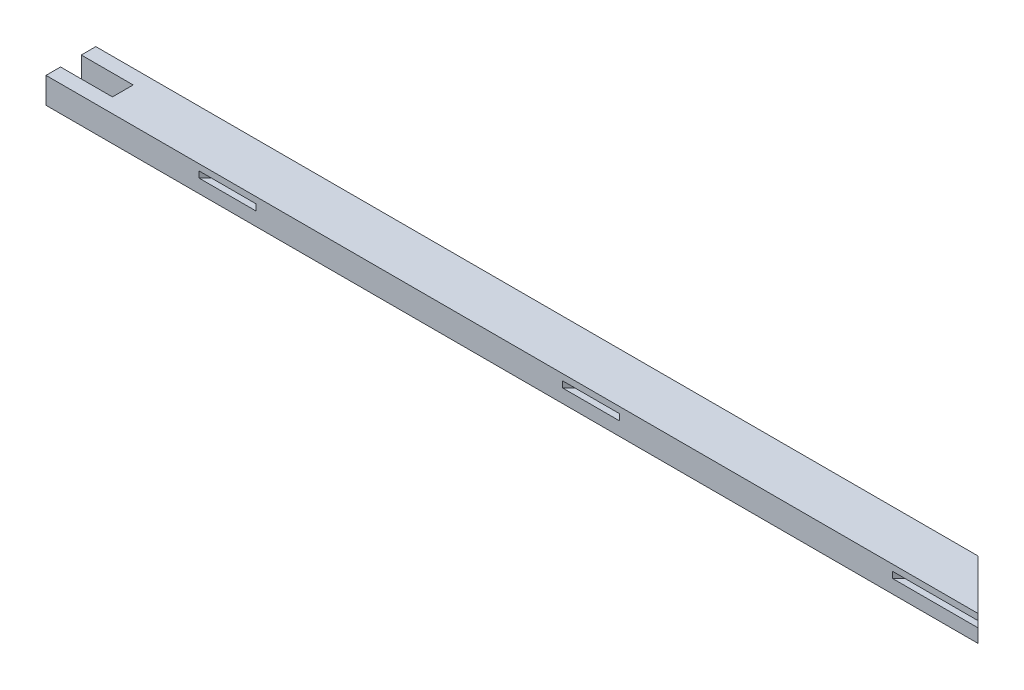
ISO-10303-21;
HEADER;
FILE_DESCRIPTION(('STEP AP214'),'2;1');
FILE_NAME('part.step','',(''),(''),'','','');
FILE_SCHEMA(('AUTOMOTIVE_DESIGN { 1 0 10303 214 1 1 1 1 }'));
ENDSEC;
DATA;
#1=APPLICATION_CONTEXT('core data for automotive mechanical design processes');
#2=APPLICATION_PROTOCOL_DEFINITION('international standard','automotive_design',2000,#1);
#3=PRODUCT_CONTEXT('',#1,'mechanical');
#4=PRODUCT('Part','Part','',(#3));
#5=PRODUCT_RELATED_PRODUCT_CATEGORY('part','',(#4));
#6=PRODUCT_DEFINITION_FORMATION('','',#4);
#7=PRODUCT_DEFINITION_CONTEXT('part definition',#1,'design');
#8=PRODUCT_DEFINITION('design','',#6,#7);
#9=PRODUCT_DEFINITION_SHAPE('','',#8);
#10=(LENGTH_UNIT() NAMED_UNIT(*) SI_UNIT(.MILLI.,.METRE.));
#11=(NAMED_UNIT(*) PLANE_ANGLE_UNIT() SI_UNIT($,.RADIAN.));
#12=(NAMED_UNIT(*) SI_UNIT($,.STERADIAN.) SOLID_ANGLE_UNIT());
#13=UNCERTAINTY_MEASURE_WITH_UNIT(LENGTH_MEASURE(1.E-05),#10,'distance_accuracy_value','');
#14=(GEOMETRIC_REPRESENTATION_CONTEXT(3) GLOBAL_UNCERTAINTY_ASSIGNED_CONTEXT((#13)) GLOBAL_UNIT_ASSIGNED_CONTEXT((#10,
#11,#12)) REPRESENTATION_CONTEXT('',''));
#15=CARTESIAN_POINT('',(0.,0.,0.));
#16=DIRECTION('',(0.,0.,1.));
#17=DIRECTION('',(1.,0.,0.));
#18=AXIS2_PLACEMENT_3D('',#15,#16,#17);
#19=CARTESIAN_POINT('',(898.,25.,48.0000000000001));
#20=DIRECTION('',(-0.707106781186542,0.,0.707106781186553));
#21=DIRECTION('',(0.707106781186553,0.,0.707106781186542));
#22=AXIS2_PLACEMENT_3D('',#19,#20,#21);
#23=PLANE('',#22);
#24=DIRECTION('',(-0.707106781186553,0.,-0.707106781186542));
#25=VECTOR('',#24,1.);
#26=CARTESIAN_POINT('',(898.,13.,48.0000000000001));
#27=LINE('',#26,#25);
#28=CARTESIAN_POINT('',(857.499999999999,13.,7.49999999999999));
#29=VERTEX_POINT('',#28);
#30=CARTESIAN_POINT('',(849.999999999999,13.,0.));
#31=VERTEX_POINT('',#30);
#32=EDGE_CURVE('E257',#29,#31,#27,.T.);
#33=ORIENTED_EDGE('',*,*,#32,.F.);
#34=DIRECTION('',(0.,-1.,0.));
#35=VECTOR('',#34,1.);
#36=CARTESIAN_POINT('',(857.499999999999,25.,7.49999999999999));
#37=LINE('',#36,#35);
#38=CARTESIAN_POINT('',(857.499999999999,19.,7.49999999999999));
#39=VERTEX_POINT('',#38);
#40=EDGE_CURVE('E11',#39,#29,#37,.T.);
#41=ORIENTED_EDGE('',*,*,#40,.F.);
#42=DIRECTION('',(-0.707106781186553,0.,-0.707106781186542));
#43=VECTOR('',#42,1.);
#44=CARTESIAN_POINT('',(898.,19.,48.0000000000001));
#45=LINE('',#44,#43);
#46=CARTESIAN_POINT('',(849.999999999999,19.,0.));
#47=VERTEX_POINT('',#46);
#48=EDGE_CURVE('E266',#39,#47,#45,.T.);
#49=ORIENTED_EDGE('',*,*,#48,.T.);
#50=DIRECTION('',(0.,-1.,0.));
#51=VECTOR('',#50,1.);
#52=CARTESIAN_POINT('',(849.999999999999,25.,0.));
#53=LINE('',#52,#51);
#54=CARTESIAN_POINT('',(849.999999999999,25.,0.));
#55=VERTEX_POINT('',#54);
#56=EDGE_CURVE('E466',#55,#47,#53,.T.);
#57=ORIENTED_EDGE('',*,*,#56,.F.);
#58=DIRECTION('',(-0.707106781186553,0.,-0.707106781186542));
#59=VECTOR('',#58,1.);
#60=CARTESIAN_POINT('',(898.,25.,48.0000000000001));
#61=LINE('',#60,#59);
#62=CARTESIAN_POINT('',(898.,25.,48.0000000000001));
#63=VERTEX_POINT('',#62);
#64=EDGE_CURVE('E446',#63,#55,#61,.T.);
#65=ORIENTED_EDGE('',*,*,#64,.F.);
#66=DIRECTION('',(0.,-1.,0.));
#67=VECTOR('',#66,1.);
#68=CARTESIAN_POINT('',(898.,25.,48.0000000000001));
#69=LINE('',#68,#67);
#70=CARTESIAN_POINT('',(898.,19.,48.0000000000001));
#71=VERTEX_POINT('',#70);
#72=EDGE_CURVE('E469',#63,#71,#69,.T.);
#73=ORIENTED_EDGE('',*,*,#72,.T.);
#74=DIRECTION('',(-0.707106781186546,0.,-0.70710678118655));
#75=VECTOR('',#74,1.);
#76=CARTESIAN_POINT('',(898.,19.,48.0000000000001));
#77=LINE('',#76,#75);
#78=CARTESIAN_POINT('',(890.5,19.,40.5));
#79=VERTEX_POINT('',#78);
#80=EDGE_CURVE('E274',#71,#79,#77,.T.);
#81=ORIENTED_EDGE('',*,*,#80,.T.);
#82=DIRECTION('',(0.,1.,0.));
#83=VECTOR('',#82,1.);
#84=CARTESIAN_POINT('',(890.5,13.,40.5));
#85=LINE('',#84,#83);
#86=CARTESIAN_POINT('',(890.5,13.,40.5));
#87=VERTEX_POINT('',#86);
#88=EDGE_CURVE('E287',#87,#79,#85,.T.);
#89=ORIENTED_EDGE('',*,*,#88,.F.);
#90=DIRECTION('',(-0.707106781186546,0.,-0.70710678118655));
#91=VECTOR('',#90,1.);
#92=CARTESIAN_POINT('',(898.,13.,48.0000000000001));
#93=LINE('',#92,#91);
#94=CARTESIAN_POINT('',(898.,13.,48.0000000000001));
#95=VERTEX_POINT('',#94);
#96=EDGE_CURVE('E275',#95,#87,#93,.T.);
#97=ORIENTED_EDGE('',*,*,#96,.F.);
#98=CARTESIAN_POINT('',(898.,0.,48.0000000000001));
#99=VERTEX_POINT('',#98);
#100=EDGE_CURVE('E468',#95,#99,#69,.T.);
#101=ORIENTED_EDGE('',*,*,#100,.T.);
#102=DIRECTION('',(-0.707106781186553,0.,-0.707106781186542));
#103=VECTOR('',#102,1.);
#104=CARTESIAN_POINT('',(898.,0.,48.0000000000001));
#105=LINE('',#104,#103);
#106=CARTESIAN_POINT('',(849.999999999999,0.,0.));
#107=VERTEX_POINT('',#106);
#108=EDGE_CURVE('E434',#99,#107,#105,.T.);
#109=ORIENTED_EDGE('',*,*,#108,.T.);
#110=EDGE_CURVE('E448',#31,#107,#53,.T.);
#111=ORIENTED_EDGE('',*,*,#110,.F.);
#112=EDGE_LOOP('',(#33,#41,#49,#57,#65,#73,#81,#89,#97,#101,#109,#111));
#113=FACE_BOUND('',#112,.T.);
#114=ADVANCED_FACE('F35',(#113),#23,.F.);
#115=CARTESIAN_POINT('',(849.999999999999,25.,0.));
#116=DIRECTION('',(0.,0.,1.));
#117=DIRECTION('',(1.,0.,0.));
#118=AXIS2_PLACEMENT_3D('',#115,#116,#117);
#119=PLANE('',#118);
#120=DIRECTION('',(-1.,0.,0.));
#121=VECTOR('',#120,1.);
#122=CARTESIAN_POINT('',(497.5,13.,0.));
#123=LINE('',#122,#121);
#124=CARTESIAN_POINT('',(552.5,13.,0.));
#125=VERTEX_POINT('',#124);
#126=CARTESIAN_POINT('',(497.5,13.,0.));
#127=VERTEX_POINT('',#126);
#128=EDGE_CURVE('E362',#125,#127,#123,.T.);
#129=ORIENTED_EDGE('',*,*,#128,.F.);
#130=DIRECTION('',(0.,1.,0.));
#131=VECTOR('',#130,1.);
#132=CARTESIAN_POINT('',(552.5,13.,0.));
#133=LINE('',#132,#131);
#134=CARTESIAN_POINT('',(552.5,19.,0.));
#135=VERTEX_POINT('',#134);
#136=EDGE_CURVE('E386',#125,#135,#133,.T.);
#137=ORIENTED_EDGE('',*,*,#136,.T.);
#138=DIRECTION('',(-1.,0.,0.));
#139=VECTOR('',#138,1.);
#140=CARTESIAN_POINT('',(497.5,19.,0.));
#141=LINE('',#140,#139);
#142=CARTESIAN_POINT('',(497.5,19.,0.));
#143=VERTEX_POINT('',#142);
#144=EDGE_CURVE('E354',#135,#143,#141,.T.);
#145=ORIENTED_EDGE('',*,*,#144,.T.);
#146=DIRECTION('',(0.,1.,0.));
#147=VECTOR('',#146,1.);
#148=CARTESIAN_POINT('',(497.5,13.,0.));
#149=LINE('',#148,#147);
#150=EDGE_CURVE('E375',#127,#143,#149,.T.);
#151=ORIENTED_EDGE('',*,*,#150,.F.);
#152=EDGE_LOOP('',(#129,#137,#145,#151));
#153=FACE_BOUND('',#152,.T.);
#154=DIRECTION('',(-1.,0.,0.));
#155=VECTOR('',#154,1.);
#156=CARTESIAN_POINT('',(147.5,13.,0.));
#157=LINE('',#156,#155);
#158=CARTESIAN_POINT('',(202.5,13.,0.));
#159=VERTEX_POINT('',#158);
#160=CARTESIAN_POINT('',(147.5,13.,0.));
#161=VERTEX_POINT('',#160);
#162=EDGE_CURVE('E396',#159,#161,#157,.T.);
#163=ORIENTED_EDGE('',*,*,#162,.F.);
#164=DIRECTION('',(0.,1.,0.));
#165=VECTOR('',#164,1.);
#166=CARTESIAN_POINT('',(202.5,13.,0.));
#167=LINE('',#166,#165);
#168=CARTESIAN_POINT('',(202.5,19.,0.));
#169=VERTEX_POINT('',#168);
#170=EDGE_CURVE('E420',#159,#169,#167,.T.);
#171=ORIENTED_EDGE('',*,*,#170,.T.);
#172=DIRECTION('',(-1.,0.,0.));
#173=VECTOR('',#172,1.);
#174=CARTESIAN_POINT('',(147.5,19.,0.));
#175=LINE('',#174,#173);
#176=CARTESIAN_POINT('',(147.5,19.,0.));
#177=VERTEX_POINT('',#176);
#178=EDGE_CURVE('E389',#169,#177,#175,.T.);
#179=ORIENTED_EDGE('',*,*,#178,.T.);
#180=DIRECTION('',(0.,1.,0.));
#181=VECTOR('',#180,1.);
#182=CARTESIAN_POINT('',(147.5,13.,0.));
#183=LINE('',#182,#181);
#184=EDGE_CURVE('E409',#161,#177,#183,.T.);
#185=ORIENTED_EDGE('',*,*,#184,.F.);
#186=EDGE_LOOP('',(#163,#171,#179,#185));
#187=FACE_BOUND('',#186,.T.);
#188=DIRECTION('',(1.,0.,0.));
#189=VECTOR('',#188,1.);
#190=CARTESIAN_POINT('',(815.5,13.,0.));
#191=LINE('',#190,#189);
#192=CARTESIAN_POINT('',(815.5,13.,0.));
#193=VERTEX_POINT('',#192);
#194=EDGE_CURVE('E252',#193,#31,#191,.T.);
#195=ORIENTED_EDGE('',*,*,#194,.T.);
#196=ORIENTED_EDGE('',*,*,#110,.T.);
#197=DIRECTION('',(-1.,0.,0.));
#198=VECTOR('',#197,1.);
#199=CARTESIAN_POINT('',(849.999999999999,0.,0.));
#200=LINE('',#199,#198);
#201=CARTESIAN_POINT('',(0.,0.,0.));
#202=VERTEX_POINT('',#201);
#203=EDGE_CURVE('E423',#107,#202,#200,.T.);
#204=ORIENTED_EDGE('',*,*,#203,.T.);
#205=DIRECTION('',(0.,-1.,0.));
#206=VECTOR('',#205,1.);
#207=CARTESIAN_POINT('',(0.,25.,0.));
#208=LINE('',#207,#206);
#209=CARTESIAN_POINT('',(0.,25.,0.));
#210=VERTEX_POINT('',#209);
#211=EDGE_CURVE('E43',#210,#202,#208,.T.);
#212=ORIENTED_EDGE('',*,*,#211,.F.);
#213=DIRECTION('',(-1.,0.,0.));
#214=VECTOR('',#213,1.);
#215=CARTESIAN_POINT('',(849.999999999999,25.,0.));
#216=LINE('',#215,#214);
#217=EDGE_CURVE('E430',#55,#210,#216,.T.);
#218=ORIENTED_EDGE('',*,*,#217,.F.);
#219=ORIENTED_EDGE('',*,*,#56,.T.);
#220=DIRECTION('',(1.,0.,0.));
#221=VECTOR('',#220,1.);
#222=CARTESIAN_POINT('',(815.5,19.,0.));
#223=LINE('',#222,#221);
#224=CARTESIAN_POINT('',(815.5,19.,0.));
#225=VERTEX_POINT('',#224);
#226=EDGE_CURVE('E264',#225,#47,#223,.T.);
#227=ORIENTED_EDGE('',*,*,#226,.F.);
#228=DIRECTION('',(0.,1.,0.));
#229=VECTOR('',#228,1.);
#230=CARTESIAN_POINT('',(815.5,13.,0.));
#231=LINE('',#230,#229);
#232=EDGE_CURVE('E50',#193,#225,#231,.T.);
#233=ORIENTED_EDGE('',*,*,#232,.F.);
#234=EDGE_LOOP('',(#195,#196,#204,#212,#218,#219,#227,#233));
#235=FACE_BOUND('',#234,.T.);
#236=ADVANCED_FACE('F37',(#153,#187,#235),#119,.F.);
#237=CARTESIAN_POINT('',(0.,25.,48.));
#238=DIRECTION('',(0.,0.,-1.));
#239=DIRECTION('',(-1.,0.,0.));
#240=AXIS2_PLACEMENT_3D('',#237,#238,#239);
#241=PLANE('',#240);
#242=DIRECTION('',(-1.,0.,0.));
#243=VECTOR('',#242,1.);
#244=CARTESIAN_POINT('',(497.5,13.,48.));
#245=LINE('',#244,#243);
#246=CARTESIAN_POINT('',(552.5,13.,48.));
#247=VERTEX_POINT('',#246);
#248=CARTESIAN_POINT('',(497.5,13.,48.));
#249=VERTEX_POINT('',#248);
#250=EDGE_CURVE('E302',#247,#249,#245,.T.);
#251=ORIENTED_EDGE('',*,*,#250,.T.);
#252=DIRECTION('',(0.,1.,0.));
#253=VECTOR('',#252,1.);
#254=CARTESIAN_POINT('',(497.5,13.,48.));
#255=LINE('',#254,#253);
#256=CARTESIAN_POINT('',(497.5,19.,48.));
#257=VERTEX_POINT('',#256);
#258=EDGE_CURVE('E321',#249,#257,#255,.T.);
#259=ORIENTED_EDGE('',*,*,#258,.T.);
#260=DIRECTION('',(-1.,0.,0.));
#261=VECTOR('',#260,1.);
#262=CARTESIAN_POINT('',(497.5,19.,48.));
#263=LINE('',#262,#261);
#264=CARTESIAN_POINT('',(552.5,19.,48.0000000000001));
#265=VERTEX_POINT('',#264);
#266=EDGE_CURVE('E298',#265,#257,#263,.T.);
#267=ORIENTED_EDGE('',*,*,#266,.F.);
#268=DIRECTION('',(0.,1.,0.));
#269=VECTOR('',#268,1.);
#270=CARTESIAN_POINT('',(552.5,13.,48.));
#271=LINE('',#270,#269);
#272=EDGE_CURVE('E312',#247,#265,#271,.T.);
#273=ORIENTED_EDGE('',*,*,#272,.F.);
#274=EDGE_LOOP('',(#251,#259,#267,#273));
#275=FACE_BOUND('',#274,.T.);
#276=DIRECTION('',(-1.,0.,0.));
#277=VECTOR('',#276,1.);
#278=CARTESIAN_POINT('',(147.5,13.,48.));
#279=LINE('',#278,#277);
#280=CARTESIAN_POINT('',(202.5,13.,48.));
#281=VERTEX_POINT('',#280);
#282=CARTESIAN_POINT('',(147.5,13.,48.));
#283=VERTEX_POINT('',#282);
#284=EDGE_CURVE('E332',#281,#283,#279,.T.);
#285=ORIENTED_EDGE('',*,*,#284,.T.);
#286=DIRECTION('',(0.,1.,0.));
#287=VECTOR('',#286,1.);
#288=CARTESIAN_POINT('',(147.5,13.,48.));
#289=LINE('',#288,#287);
#290=CARTESIAN_POINT('',(147.5,19.,48.));
#291=VERTEX_POINT('',#290);
#292=EDGE_CURVE('E351',#283,#291,#289,.T.);
#293=ORIENTED_EDGE('',*,*,#292,.T.);
#294=DIRECTION('',(-1.,0.,0.));
#295=VECTOR('',#294,1.);
#296=CARTESIAN_POINT('',(147.5,19.,48.));
#297=LINE('',#296,#295);
#298=CARTESIAN_POINT('',(202.5,19.,48.));
#299=VERTEX_POINT('',#298);
#300=EDGE_CURVE('E324',#299,#291,#297,.T.);
#301=ORIENTED_EDGE('',*,*,#300,.F.);
#302=DIRECTION('',(0.,1.,0.));
#303=VECTOR('',#302,1.);
#304=CARTESIAN_POINT('',(202.5,13.,48.));
#305=LINE('',#304,#303);
#306=EDGE_CURVE('E342',#281,#299,#305,.T.);
#307=ORIENTED_EDGE('',*,*,#306,.F.);
#308=EDGE_LOOP('',(#285,#293,#301,#307));
#309=FACE_BOUND('',#308,.T.);
#310=DIRECTION('',(1.,0.,0.));
#311=VECTOR('',#310,1.);
#312=CARTESIAN_POINT('',(815.5,13.,48.));
#313=LINE('',#312,#311);
#314=CARTESIAN_POINT('',(815.5,13.,48.));
#315=VERTEX_POINT('',#314);
#316=EDGE_CURVE('E285',#315,#95,#313,.T.);
#317=ORIENTED_EDGE('',*,*,#316,.F.);
#318=DIRECTION('',(0.,1.,0.));
#319=VECTOR('',#318,1.);
#320=CARTESIAN_POINT('',(815.5,13.,48.));
#321=LINE('',#320,#319);
#322=CARTESIAN_POINT('',(815.5,19.,48.));
#323=VERTEX_POINT('',#322);
#324=EDGE_CURVE('E295',#315,#323,#321,.T.);
#325=ORIENTED_EDGE('',*,*,#324,.T.);
#326=DIRECTION('',(1.,0.,0.));
#327=VECTOR('',#326,1.);
#328=CARTESIAN_POINT('',(815.5,19.,48.));
#329=LINE('',#328,#327);
#330=EDGE_CURVE('E279',#323,#71,#329,.T.);
#331=ORIENTED_EDGE('',*,*,#330,.T.);
#332=ORIENTED_EDGE('',*,*,#72,.F.);
#333=DIRECTION('',(1.,0.,0.));
#334=VECTOR('',#333,1.);
#335=CARTESIAN_POINT('',(0.,25.,48.));
#336=LINE('',#335,#334);
#337=CARTESIAN_POINT('',(0.,25.,48.));
#338=VERTEX_POINT('',#337);
#339=EDGE_CURVE('E444',#338,#63,#336,.T.);
#340=ORIENTED_EDGE('',*,*,#339,.F.);
#341=DIRECTION('',(0.,-1.,0.));
#342=VECTOR('',#341,1.);
#343=CARTESIAN_POINT('',(0.,25.,48.));
#344=LINE('',#343,#342);
#345=CARTESIAN_POINT('',(0.,0.,48.));
#346=VERTEX_POINT('',#345);
#347=EDGE_CURVE('E472',#338,#346,#344,.T.);
#348=ORIENTED_EDGE('',*,*,#347,.T.);
#349=DIRECTION('',(1.,0.,0.));
#350=VECTOR('',#349,1.);
#351=CARTESIAN_POINT('',(0.,0.,48.));
#352=LINE('',#351,#350);
#353=EDGE_CURVE('E461',#346,#99,#352,.T.);
#354=ORIENTED_EDGE('',*,*,#353,.T.);
#355=ORIENTED_EDGE('',*,*,#100,.F.);
#356=EDGE_LOOP('',(#317,#325,#331,#332,#340,#348,#354,#355));
#357=FACE_BOUND('',#356,.T.);
#358=ADVANCED_FACE('F529',(#275,#309,#357),#241,.F.);
#359=CARTESIAN_POINT('',(0.,25.,0.));
#360=DIRECTION('',(1.,0.,0.));
#361=DIRECTION('',(0.,0.,-1.));
#362=AXIS2_PLACEMENT_3D('',#359,#360,#361);
#363=PLANE('',#362);
#364=DIRECTION('',(0.,0.,1.));
#365=VECTOR('',#364,1.);
#366=CARTESIAN_POINT('',(0.,0.,0.));
#367=LINE('',#366,#365);
#368=CARTESIAN_POINT('',(0.,0.,14.0000000000001));
#369=VERTEX_POINT('',#368);
#370=EDGE_CURVE('E451',#202,#369,#367,.T.);
#371=ORIENTED_EDGE('',*,*,#370,.T.);
#372=DIRECTION('',(0.,-1.,0.));
#373=VECTOR('',#372,1.);
#374=CARTESIAN_POINT('',(0.,25.,14.0000000000001));
#375=LINE('',#374,#373);
#376=CARTESIAN_POINT('',(0.,25.,14.0000000000001));
#377=VERTEX_POINT('',#376);
#378=EDGE_CURVE('E484',#377,#369,#375,.T.);
#379=ORIENTED_EDGE('',*,*,#378,.F.);
#380=DIRECTION('',(0.,0.,1.));
#381=VECTOR('',#380,1.);
#382=CARTESIAN_POINT('',(0.,25.,0.));
#383=LINE('',#382,#381);
#384=EDGE_CURVE('E433',#210,#377,#383,.T.);
#385=ORIENTED_EDGE('',*,*,#384,.F.);
#386=ORIENTED_EDGE('',*,*,#211,.T.);
#387=EDGE_LOOP('',(#371,#379,#385,#386));
#388=FACE_BOUND('',#387,.T.);
#389=ADVANCED_FACE('F489',(#388),#363,.F.);
#390=CARTESIAN_POINT('',(0.,25.,14.0000000000001));
#391=DIRECTION('',(0.,0.,-1.));
#392=DIRECTION('',(-1.,0.,0.));
#393=AXIS2_PLACEMENT_3D('',#390,#391,#392);
#394=PLANE('',#393);
#395=DIRECTION('',(1.,0.,0.));
#396=VECTOR('',#395,1.);
#397=CARTESIAN_POINT('',(0.,0.,14.0000000000001));
#398=LINE('',#397,#396);
#399=CARTESIAN_POINT('',(50.,0.,14.0000000000001));
#400=VERTEX_POINT('',#399);
#401=EDGE_CURVE('E453',#369,#400,#398,.T.);
#402=ORIENTED_EDGE('',*,*,#401,.T.);
#403=DIRECTION('',(0.,-1.,0.));
#404=VECTOR('',#403,1.);
#405=CARTESIAN_POINT('',(50.,25.,14.0000000000001));
#406=LINE('',#405,#404);
#407=CARTESIAN_POINT('',(50.,25.,14.0000000000001));
#408=VERTEX_POINT('',#407);
#409=EDGE_CURVE('E481',#408,#400,#406,.T.);
#410=ORIENTED_EDGE('',*,*,#409,.F.);
#411=DIRECTION('',(1.,0.,0.));
#412=VECTOR('',#411,1.);
#413=CARTESIAN_POINT('',(0.,25.,14.0000000000001));
#414=LINE('',#413,#412);
#415=EDGE_CURVE('E436',#377,#408,#414,.T.);
#416=ORIENTED_EDGE('',*,*,#415,.F.);
#417=ORIENTED_EDGE('',*,*,#378,.T.);
#418=EDGE_LOOP('',(#402,#410,#416,#417));
#419=FACE_BOUND('',#418,.T.);
#420=ADVANCED_FACE('F502',(#419),#394,.F.);
#421=CARTESIAN_POINT('',(50.,25.,14.0000000000001));
#422=DIRECTION('',(1.,0.,0.));
#423=DIRECTION('',(0.,0.,-1.));
#424=AXIS2_PLACEMENT_3D('',#421,#422,#423);
#425=PLANE('',#424);
#426=DIRECTION('',(0.,0.,1.));
#427=VECTOR('',#426,1.);
#428=CARTESIAN_POINT('',(50.,0.,14.0000000000001));
#429=LINE('',#428,#427);
#430=CARTESIAN_POINT('',(50.,0.,34.0000000000001));
#431=VERTEX_POINT('',#430);
#432=EDGE_CURVE('E455',#400,#431,#429,.T.);
#433=ORIENTED_EDGE('',*,*,#432,.T.);
#434=DIRECTION('',(0.,-1.,0.));
#435=VECTOR('',#434,1.);
#436=CARTESIAN_POINT('',(50.,25.,34.0000000000001));
#437=LINE('',#436,#435);
#438=CARTESIAN_POINT('',(50.,25.,34.0000000000001));
#439=VERTEX_POINT('',#438);
#440=EDGE_CURVE('E478',#439,#431,#437,.T.);
#441=ORIENTED_EDGE('',*,*,#440,.F.);
#442=DIRECTION('',(0.,0.,1.));
#443=VECTOR('',#442,1.);
#444=CARTESIAN_POINT('',(50.,25.,14.0000000000001));
#445=LINE('',#444,#443);
#446=EDGE_CURVE('E438',#408,#439,#445,.T.);
#447=ORIENTED_EDGE('',*,*,#446,.F.);
#448=ORIENTED_EDGE('',*,*,#409,.T.);
#449=EDGE_LOOP('',(#433,#441,#447,#448));
#450=FACE_BOUND('',#449,.T.);
#451=ADVANCED_FACE('F506',(#450),#425,.F.);
#452=CARTESIAN_POINT('',(50.,25.,34.0000000000001));
#453=DIRECTION('',(0.,0.,1.));
#454=DIRECTION('',(1.,0.,0.));
#455=AXIS2_PLACEMENT_3D('',#452,#453,#454);
#456=PLANE('',#455);
#457=DIRECTION('',(-1.,0.,0.));
#458=VECTOR('',#457,1.);
#459=CARTESIAN_POINT('',(50.,0.,34.0000000000001));
#460=LINE('',#459,#458);
#461=CARTESIAN_POINT('',(0.,0.,34.0000000000001));
#462=VERTEX_POINT('',#461);
#463=EDGE_CURVE('E457',#431,#462,#460,.T.);
#464=ORIENTED_EDGE('',*,*,#463,.T.);
#465=DIRECTION('',(0.,-1.,0.));
#466=VECTOR('',#465,1.);
#467=CARTESIAN_POINT('',(0.,25.,34.0000000000001));
#468=LINE('',#467,#466);
#469=CARTESIAN_POINT('',(0.,25.,34.0000000000001));
#470=VERTEX_POINT('',#469);
#471=EDGE_CURVE('E475',#470,#462,#468,.T.);
#472=ORIENTED_EDGE('',*,*,#471,.F.);
#473=DIRECTION('',(-1.,0.,0.));
#474=VECTOR('',#473,1.);
#475=CARTESIAN_POINT('',(50.,25.,34.0000000000001));
#476=LINE('',#475,#474);
#477=EDGE_CURVE('E440',#439,#470,#476,.T.);
#478=ORIENTED_EDGE('',*,*,#477,.F.);
#479=ORIENTED_EDGE('',*,*,#440,.T.);
#480=EDGE_LOOP('',(#464,#472,#478,#479));
#481=FACE_BOUND('',#480,.T.);
#482=ADVANCED_FACE('F537',(#481),#456,.F.);
#483=CARTESIAN_POINT('',(0.,25.,34.0000000000001));
#484=DIRECTION('',(1.,0.,0.));
#485=DIRECTION('',(0.,0.,-1.));
#486=AXIS2_PLACEMENT_3D('',#483,#484,#485);
#487=PLANE('',#486);
#488=DIRECTION('',(0.,0.,1.));
#489=VECTOR('',#488,1.);
#490=CARTESIAN_POINT('',(0.,0.,34.0000000000001));
#491=LINE('',#490,#489);
#492=EDGE_CURVE('E459',#462,#346,#491,.T.);
#493=ORIENTED_EDGE('',*,*,#492,.T.);
#494=ORIENTED_EDGE('',*,*,#347,.F.);
#495=DIRECTION('',(0.,0.,1.));
#496=VECTOR('',#495,1.);
#497=CARTESIAN_POINT('',(0.,25.,34.0000000000001));
#498=LINE('',#497,#496);
#499=EDGE_CURVE('E442',#470,#338,#498,.T.);
#500=ORIENTED_EDGE('',*,*,#499,.F.);
#501=ORIENTED_EDGE('',*,*,#471,.T.);
#502=EDGE_LOOP('',(#493,#494,#500,#501));
#503=FACE_BOUND('',#502,.T.);
#504=ADVANCED_FACE('F534',(#503),#487,.F.);
#505=CARTESIAN_POINT('',(0.,25.,0.));
#506=DIRECTION('',(0.,1.,0.));
#507=DIRECTION('',(0.,0.,1.));
#508=AXIS2_PLACEMENT_3D('',#505,#506,#507);
#509=PLANE('',#508);
#510=ORIENTED_EDGE('',*,*,#217,.T.);
#511=ORIENTED_EDGE('',*,*,#384,.T.);
#512=ORIENTED_EDGE('',*,*,#415,.T.);
#513=ORIENTED_EDGE('',*,*,#446,.T.);
#514=ORIENTED_EDGE('',*,*,#477,.T.);
#515=ORIENTED_EDGE('',*,*,#499,.T.);
#516=ORIENTED_EDGE('',*,*,#339,.T.);
#517=ORIENTED_EDGE('',*,*,#64,.T.);
#518=EDGE_LOOP('',(#510,#511,#512,#513,#514,#515,#516,#517));
#519=FACE_BOUND('',#518,.T.);
#520=ADVANCED_FACE('F510',(#519),#509,.T.);
#521=CARTESIAN_POINT('',(0.,0.,0.));
#522=DIRECTION('',(0.,1.,0.));
#523=DIRECTION('',(0.,0.,1.));
#524=AXIS2_PLACEMENT_3D('',#521,#522,#523);
#525=PLANE('',#524);
#526=ORIENTED_EDGE('',*,*,#203,.F.);
#527=ORIENTED_EDGE('',*,*,#108,.F.);
#528=ORIENTED_EDGE('',*,*,#353,.F.);
#529=ORIENTED_EDGE('',*,*,#492,.F.);
#530=ORIENTED_EDGE('',*,*,#463,.F.);
#531=ORIENTED_EDGE('',*,*,#432,.F.);
#532=ORIENTED_EDGE('',*,*,#401,.F.);
#533=ORIENTED_EDGE('',*,*,#370,.F.);
#534=EDGE_LOOP('',(#526,#527,#528,#529,#530,#531,#532,#533));
#535=FACE_BOUND('',#534,.T.);
#536=ADVANCED_FACE('F495',(#535),#525,.F.);
#537=CARTESIAN_POINT('',(195.,13.,7.49999999999999));
#538=DIRECTION('',(0.707106781186551,0.,0.707106781186544));
#539=DIRECTION('',(0.707106781186544,0.,-0.707106781186551));
#540=AXIS2_PLACEMENT_3D('',#537,#538,#539);
#541=PLANE('',#540);
#542=DIRECTION('',(0.707106781186544,0.,-0.707106781186551));
#543=VECTOR('',#542,1.);
#544=CARTESIAN_POINT('',(195.,19.,7.49999999999999));
#545=LINE('',#544,#543);
#546=CARTESIAN_POINT('',(195.,19.,7.49999999999999));
#547=VERTEX_POINT('',#546);
#548=EDGE_CURVE('E400',#547,#169,#545,.T.);
#549=ORIENTED_EDGE('',*,*,#548,.T.);
#550=ORIENTED_EDGE('',*,*,#170,.F.);
#551=DIRECTION('',(0.707106781186544,0.,-0.707106781186551));
#552=VECTOR('',#551,1.);
#553=CARTESIAN_POINT('',(195.,13.,7.49999999999999));
#554=LINE('',#553,#552);
#555=CARTESIAN_POINT('',(195.,13.,7.49999999999999));
#556=VERTEX_POINT('',#555);
#557=EDGE_CURVE('E406',#556,#159,#554,.T.);
#558=ORIENTED_EDGE('',*,*,#557,.F.);
#559=DIRECTION('',(0.,1.,0.));
#560=VECTOR('',#559,1.);
#561=CARTESIAN_POINT('',(195.,13.,7.49999999999999));
#562=LINE('',#561,#560);
#563=EDGE_CURVE('E424',#556,#547,#562,.T.);
#564=ORIENTED_EDGE('',*,*,#563,.T.);
#565=EDGE_LOOP('',(#549,#550,#558,#564));
#566=FACE_BOUND('',#565,.T.);
#567=ADVANCED_FACE('F622',(#566),#541,.F.);
#568=CARTESIAN_POINT('',(155.,13.,7.5));
#569=DIRECTION('',(0.,0.,1.));
#570=DIRECTION('',(1.,0.,0.));
#571=AXIS2_PLACEMENT_3D('',#568,#569,#570);
#572=PLANE('',#571);
#573=DIRECTION('',(1.,0.,0.));
#574=VECTOR('',#573,1.);
#575=CARTESIAN_POINT('',(155.,19.,7.5));
#576=LINE('',#575,#574);
#577=CARTESIAN_POINT('',(155.,19.,7.5));
#578=VERTEX_POINT('',#577);
#579=EDGE_CURVE('E415',#578,#547,#576,.T.);
#580=ORIENTED_EDGE('',*,*,#579,.T.);
#581=ORIENTED_EDGE('',*,*,#563,.F.);
#582=DIRECTION('',(1.,0.,0.));
#583=VECTOR('',#582,1.);
#584=CARTESIAN_POINT('',(155.,13.,7.5));
#585=LINE('',#584,#583);
#586=CARTESIAN_POINT('',(155.,13.,7.5));
#587=VERTEX_POINT('',#586);
#588=EDGE_CURVE('E403',#587,#556,#585,.T.);
#589=ORIENTED_EDGE('',*,*,#588,.F.);
#590=DIRECTION('',(0.,1.,0.));
#591=VECTOR('',#590,1.);
#592=CARTESIAN_POINT('',(155.,13.,7.5));
#593=LINE('',#592,#591);
#594=EDGE_CURVE('E426',#587,#578,#593,.T.);
#595=ORIENTED_EDGE('',*,*,#594,.T.);
#596=EDGE_LOOP('',(#580,#581,#589,#595));
#597=FACE_BOUND('',#596,.T.);
#598=ADVANCED_FACE('F625',(#597),#572,.F.);
#599=CARTESIAN_POINT('',(147.5,13.,0.));
#600=DIRECTION('',(-0.707106781186546,0.,0.707106781186549));
#601=DIRECTION('',(0.707106781186549,0.,0.707106781186546));
#602=AXIS2_PLACEMENT_3D('',#599,#600,#601);
#603=PLANE('',#602);
#604=DIRECTION('',(0.707106781186549,0.,0.707106781186546));
#605=VECTOR('',#604,1.);
#606=CARTESIAN_POINT('',(147.5,19.,0.));
#607=LINE('',#606,#605);
#608=EDGE_CURVE('E412',#177,#578,#607,.T.);
#609=ORIENTED_EDGE('',*,*,#608,.T.);
#610=ORIENTED_EDGE('',*,*,#594,.F.);
#611=DIRECTION('',(0.707106781186549,0.,0.707106781186546));
#612=VECTOR('',#611,1.);
#613=CARTESIAN_POINT('',(147.5,13.,0.));
#614=LINE('',#613,#612);
#615=EDGE_CURVE('E399',#161,#587,#614,.T.);
#616=ORIENTED_EDGE('',*,*,#615,.F.);
#617=ORIENTED_EDGE('',*,*,#184,.T.);
#618=EDGE_LOOP('',(#609,#610,#616,#617));
#619=FACE_BOUND('',#618,.T.);
#620=ADVANCED_FACE('F617',(#619),#603,.F.);
#621=CARTESIAN_POINT('',(0.,13.,0.));
#622=DIRECTION('',(0.,1.,0.));
#623=DIRECTION('',(0.,0.,1.));
#624=AXIS2_PLACEMENT_3D('',#621,#622,#623);
#625=PLANE('',#624);
#626=ORIENTED_EDGE('',*,*,#162,.T.);
#627=ORIENTED_EDGE('',*,*,#615,.T.);
#628=ORIENTED_EDGE('',*,*,#588,.T.);
#629=ORIENTED_EDGE('',*,*,#557,.T.);
#630=EDGE_LOOP('',(#626,#627,#628,#629));
#631=FACE_BOUND('',#630,.T.);
#632=ADVANCED_FACE('F614',(#631),#625,.T.);
#633=CARTESIAN_POINT('',(0.,19.,0.));
#634=DIRECTION('',(0.,1.,0.));
#635=DIRECTION('',(0.,0.,1.));
#636=AXIS2_PLACEMENT_3D('',#633,#634,#635);
#637=PLANE('',#636);
#638=ORIENTED_EDGE('',*,*,#178,.F.);
#639=ORIENTED_EDGE('',*,*,#548,.F.);
#640=ORIENTED_EDGE('',*,*,#579,.F.);
#641=ORIENTED_EDGE('',*,*,#608,.F.);
#642=EDGE_LOOP('',(#638,#639,#640,#641));
#643=FACE_BOUND('',#642,.T.);
#644=ADVANCED_FACE('F606',(#643),#637,.F.);
#645=CARTESIAN_POINT('',(545.,13.,7.49999999999999));
#646=DIRECTION('',(0.707106781186551,0.,0.707106781186544));
#647=DIRECTION('',(0.707106781186544,0.,-0.707106781186551));
#648=AXIS2_PLACEMENT_3D('',#645,#646,#647);
#649=PLANE('',#648);
#650=DIRECTION('',(0.707106781186544,0.,-0.707106781186551));
#651=VECTOR('',#650,1.);
#652=CARTESIAN_POINT('',(545.,19.,7.49999999999999));
#653=LINE('',#652,#651);
#654=CARTESIAN_POINT('',(545.,19.,7.49999999999999));
#655=VERTEX_POINT('',#654);
#656=EDGE_CURVE('E366',#655,#135,#653,.T.);
#657=ORIENTED_EDGE('',*,*,#656,.T.);
#658=ORIENTED_EDGE('',*,*,#136,.F.);
#659=DIRECTION('',(0.707106781186544,0.,-0.707106781186551));
#660=VECTOR('',#659,1.);
#661=CARTESIAN_POINT('',(545.,13.,7.49999999999999));
#662=LINE('',#661,#660);
#663=CARTESIAN_POINT('',(545.,13.,7.49999999999999));
#664=VERTEX_POINT('',#663);
#665=EDGE_CURVE('E372',#664,#125,#662,.T.);
#666=ORIENTED_EDGE('',*,*,#665,.F.);
#667=DIRECTION('',(0.,1.,0.));
#668=VECTOR('',#667,1.);
#669=CARTESIAN_POINT('',(545.,13.,7.49999999999999));
#670=LINE('',#669,#668);
#671=EDGE_CURVE('E390',#664,#655,#670,.T.);
#672=ORIENTED_EDGE('',*,*,#671,.T.);
#673=EDGE_LOOP('',(#657,#658,#666,#672));
#674=FACE_BOUND('',#673,.T.);
#675=ADVANCED_FACE('F602',(#674),#649,.F.);
#676=CARTESIAN_POINT('',(505.,13.,7.5));
#677=DIRECTION('',(0.,0.,1.));
#678=DIRECTION('',(1.,0.,0.));
#679=AXIS2_PLACEMENT_3D('',#676,#677,#678);
#680=PLANE('',#679);
#681=DIRECTION('',(1.,0.,0.));
#682=VECTOR('',#681,1.);
#683=CARTESIAN_POINT('',(505.,19.,7.5));
#684=LINE('',#683,#682);
#685=CARTESIAN_POINT('',(505.,19.,7.5));
#686=VERTEX_POINT('',#685);
#687=EDGE_CURVE('E381',#686,#655,#684,.T.);
#688=ORIENTED_EDGE('',*,*,#687,.T.);
#689=ORIENTED_EDGE('',*,*,#671,.F.);
#690=DIRECTION('',(1.,0.,0.));
#691=VECTOR('',#690,1.);
#692=CARTESIAN_POINT('',(505.,13.,7.5));
#693=LINE('',#692,#691);
#694=CARTESIAN_POINT('',(505.,13.,7.5));
#695=VERTEX_POINT('',#694);
#696=EDGE_CURVE('E369',#695,#664,#693,.T.);
#697=ORIENTED_EDGE('',*,*,#696,.F.);
#698=DIRECTION('',(0.,1.,0.));
#699=VECTOR('',#698,1.);
#700=CARTESIAN_POINT('',(505.,13.,7.5));
#701=LINE('',#700,#699);
#702=EDGE_CURVE('E392',#695,#686,#701,.T.);
#703=ORIENTED_EDGE('',*,*,#702,.T.);
#704=EDGE_LOOP('',(#688,#689,#697,#703));
#705=FACE_BOUND('',#704,.T.);
#706=ADVANCED_FACE('F605',(#705),#680,.F.);
#707=CARTESIAN_POINT('',(497.5,13.,0.));
#708=DIRECTION('',(-0.707106781186546,0.,0.707106781186549));
#709=DIRECTION('',(0.707106781186549,0.,0.707106781186546));
#710=AXIS2_PLACEMENT_3D('',#707,#708,#709);
#711=PLANE('',#710);
#712=DIRECTION('',(0.707106781186549,0.,0.707106781186546));
#713=VECTOR('',#712,1.);
#714=CARTESIAN_POINT('',(497.5,19.,0.));
#715=LINE('',#714,#713);
#716=EDGE_CURVE('E378',#143,#686,#715,.T.);
#717=ORIENTED_EDGE('',*,*,#716,.T.);
#718=ORIENTED_EDGE('',*,*,#702,.F.);
#719=DIRECTION('',(0.707106781186549,0.,0.707106781186546));
#720=VECTOR('',#719,1.);
#721=CARTESIAN_POINT('',(497.5,13.,0.));
#722=LINE('',#721,#720);
#723=EDGE_CURVE('E365',#127,#695,#722,.T.);
#724=ORIENTED_EDGE('',*,*,#723,.F.);
#725=ORIENTED_EDGE('',*,*,#150,.T.);
#726=EDGE_LOOP('',(#717,#718,#724,#725));
#727=FACE_BOUND('',#726,.T.);
#728=ADVANCED_FACE('F597',(#727),#711,.F.);
#729=CARTESIAN_POINT('',(350.,13.,0.));
#730=DIRECTION('',(0.,1.,0.));
#731=DIRECTION('',(0.,0.,1.));
#732=AXIS2_PLACEMENT_3D('',#729,#730,#731);
#733=PLANE('',#732);
#734=ORIENTED_EDGE('',*,*,#128,.T.);
#735=ORIENTED_EDGE('',*,*,#723,.T.);
#736=ORIENTED_EDGE('',*,*,#696,.T.);
#737=ORIENTED_EDGE('',*,*,#665,.T.);
#738=EDGE_LOOP('',(#734,#735,#736,#737));
#739=FACE_BOUND('',#738,.T.);
#740=ADVANCED_FACE('F594',(#739),#733,.T.);
#741=CARTESIAN_POINT('',(350.,19.,0.));
#742=DIRECTION('',(0.,1.,0.));
#743=DIRECTION('',(0.,0.,1.));
#744=AXIS2_PLACEMENT_3D('',#741,#742,#743);
#745=PLANE('',#744);
#746=ORIENTED_EDGE('',*,*,#144,.F.);
#747=ORIENTED_EDGE('',*,*,#656,.F.);
#748=ORIENTED_EDGE('',*,*,#687,.F.);
#749=ORIENTED_EDGE('',*,*,#716,.F.);
#750=EDGE_LOOP('',(#746,#747,#748,#749));
#751=FACE_BOUND('',#750,.T.);
#752=ADVANCED_FACE('F590',(#751),#745,.F.);
#753=CARTESIAN_POINT('',(147.5,13.,48.));
#754=DIRECTION('',(0.707106781186546,0.,0.707106781186549));
#755=DIRECTION('',(0.707106781186549,0.,-0.707106781186546));
#756=AXIS2_PLACEMENT_3D('',#753,#754,#755);
#757=PLANE('',#756);
#758=DIRECTION('',(0.707106781186549,0.,-0.707106781186546));
#759=VECTOR('',#758,1.);
#760=CARTESIAN_POINT('',(147.5,19.,48.));
#761=LINE('',#760,#759);
#762=CARTESIAN_POINT('',(155.,19.,40.5));
#763=VERTEX_POINT('',#762);
#764=EDGE_CURVE('E336',#291,#763,#761,.T.);
#765=ORIENTED_EDGE('',*,*,#764,.F.);
#766=ORIENTED_EDGE('',*,*,#292,.F.);
#767=DIRECTION('',(0.707106781186549,0.,-0.707106781186546));
#768=VECTOR('',#767,1.);
#769=CARTESIAN_POINT('',(147.5,13.,48.));
#770=LINE('',#769,#768);
#771=CARTESIAN_POINT('',(155.,13.,40.5));
#772=VERTEX_POINT('',#771);
#773=EDGE_CURVE('E340',#283,#772,#770,.T.);
#774=ORIENTED_EDGE('',*,*,#773,.T.);
#775=DIRECTION('',(0.,1.,0.));
#776=VECTOR('',#775,1.);
#777=CARTESIAN_POINT('',(155.,13.,40.5));
#778=LINE('',#777,#776);
#779=EDGE_CURVE('E355',#772,#763,#778,.T.);
#780=ORIENTED_EDGE('',*,*,#779,.T.);
#781=EDGE_LOOP('',(#765,#766,#774,#780));
#782=FACE_BOUND('',#781,.T.);
#783=ADVANCED_FACE('F573',(#782),#757,.T.);
#784=CARTESIAN_POINT('',(155.,13.,40.5));
#785=DIRECTION('',(0.,0.,1.));
#786=DIRECTION('',(1.,0.,0.));
#787=AXIS2_PLACEMENT_3D('',#784,#785,#786);
#788=PLANE('',#787);
#789=DIRECTION('',(1.,0.,0.));
#790=VECTOR('',#789,1.);
#791=CARTESIAN_POINT('',(155.,19.,40.5));
#792=LINE('',#791,#790);
#793=CARTESIAN_POINT('',(195.,19.,40.5));
#794=VERTEX_POINT('',#793);
#795=EDGE_CURVE('E348',#763,#794,#792,.T.);
#796=ORIENTED_EDGE('',*,*,#795,.F.);
#797=ORIENTED_EDGE('',*,*,#779,.F.);
#798=DIRECTION('',(1.,0.,0.));
#799=VECTOR('',#798,1.);
#800=CARTESIAN_POINT('',(155.,13.,40.5));
#801=LINE('',#800,#799);
#802=CARTESIAN_POINT('',(195.,13.,40.5));
#803=VERTEX_POINT('',#802);
#804=EDGE_CURVE('E338',#772,#803,#801,.T.);
#805=ORIENTED_EDGE('',*,*,#804,.T.);
#806=DIRECTION('',(0.,1.,0.));
#807=VECTOR('',#806,1.);
#808=CARTESIAN_POINT('',(195.,13.,40.5));
#809=LINE('',#808,#807);
#810=EDGE_CURVE('E358',#803,#794,#809,.T.);
#811=ORIENTED_EDGE('',*,*,#810,.T.);
#812=EDGE_LOOP('',(#796,#797,#805,#811));
#813=FACE_BOUND('',#812,.T.);
#814=ADVANCED_FACE('F582',(#813),#788,.T.);
#815=CARTESIAN_POINT('',(195.,13.,40.5));
#816=DIRECTION('',(-0.707106781186551,0.,0.707106781186544));
#817=DIRECTION('',(0.707106781186544,0.,0.707106781186551));
#818=AXIS2_PLACEMENT_3D('',#815,#816,#817);
#819=PLANE('',#818);
#820=DIRECTION('',(0.707106781186544,0.,0.707106781186551));
#821=VECTOR('',#820,1.);
#822=CARTESIAN_POINT('',(195.,19.,40.5));
#823=LINE('',#822,#821);
#824=EDGE_CURVE('E345',#794,#299,#823,.T.);
#825=ORIENTED_EDGE('',*,*,#824,.F.);
#826=ORIENTED_EDGE('',*,*,#810,.F.);
#827=DIRECTION('',(0.707106781186544,0.,0.707106781186551));
#828=VECTOR('',#827,1.);
#829=CARTESIAN_POINT('',(195.,13.,40.5));
#830=LINE('',#829,#828);
#831=EDGE_CURVE('E335',#803,#281,#830,.T.);
#832=ORIENTED_EDGE('',*,*,#831,.T.);
#833=ORIENTED_EDGE('',*,*,#306,.T.);
#834=EDGE_LOOP('',(#825,#826,#832,#833));
#835=FACE_BOUND('',#834,.T.);
#836=ADVANCED_FACE('F580',(#835),#819,.T.);
#837=CARTESIAN_POINT('',(0.,13.,48.));
#838=DIRECTION('',(0.,1.,0.));
#839=DIRECTION('',(0.,0.,-1.));
#840=AXIS2_PLACEMENT_3D('',#837,#838,#839);
#841=PLANE('',#840);
#842=ORIENTED_EDGE('',*,*,#284,.F.);
#843=ORIENTED_EDGE('',*,*,#831,.F.);
#844=ORIENTED_EDGE('',*,*,#804,.F.);
#845=ORIENTED_EDGE('',*,*,#773,.F.);
#846=EDGE_LOOP('',(#842,#843,#844,#845));
#847=FACE_BOUND('',#846,.T.);
#848=ADVANCED_FACE('F569',(#847),#841,.T.);
#849=CARTESIAN_POINT('',(0.,19.,48.));
#850=DIRECTION('',(0.,1.,0.));
#851=DIRECTION('',(0.,0.,-1.));
#852=AXIS2_PLACEMENT_3D('',#849,#850,#851);
#853=PLANE('',#852);
#854=ORIENTED_EDGE('',*,*,#300,.T.);
#855=ORIENTED_EDGE('',*,*,#764,.T.);
#856=ORIENTED_EDGE('',*,*,#795,.T.);
#857=ORIENTED_EDGE('',*,*,#824,.T.);
#858=EDGE_LOOP('',(#854,#855,#856,#857));
#859=FACE_BOUND('',#858,.T.);
#860=ADVANCED_FACE('F576',(#859),#853,.F.);
#861=CARTESIAN_POINT('',(497.5,13.,48.));
#862=DIRECTION('',(0.707106781186546,0.,0.707106781186549));
#863=DIRECTION('',(0.707106781186549,0.,-0.707106781186546));
#864=AXIS2_PLACEMENT_3D('',#861,#862,#863);
#865=PLANE('',#864);
#866=DIRECTION('',(0.707106781186549,0.,-0.707106781186546));
#867=VECTOR('',#866,1.);
#868=CARTESIAN_POINT('',(497.5,19.,48.));
#869=LINE('',#868,#867);
#870=CARTESIAN_POINT('',(505.,19.,40.5));
#871=VERTEX_POINT('',#870);
#872=EDGE_CURVE('E306',#257,#871,#869,.T.);
#873=ORIENTED_EDGE('',*,*,#872,.F.);
#874=ORIENTED_EDGE('',*,*,#258,.F.);
#875=DIRECTION('',(0.707106781186549,0.,-0.707106781186546));
#876=VECTOR('',#875,1.);
#877=CARTESIAN_POINT('',(497.5,13.,48.));
#878=LINE('',#877,#876);
#879=CARTESIAN_POINT('',(505.,13.,40.5));
#880=VERTEX_POINT('',#879);
#881=EDGE_CURVE('E310',#249,#880,#878,.T.);
#882=ORIENTED_EDGE('',*,*,#881,.T.);
#883=DIRECTION('',(0.,1.,0.));
#884=VECTOR('',#883,1.);
#885=CARTESIAN_POINT('',(505.,13.,40.5));
#886=LINE('',#885,#884);
#887=EDGE_CURVE('E325',#880,#871,#886,.T.);
#888=ORIENTED_EDGE('',*,*,#887,.T.);
#889=EDGE_LOOP('',(#873,#874,#882,#888));
#890=FACE_BOUND('',#889,.T.);
#891=ADVANCED_FACE('F709',(#890),#865,.T.);
#892=CARTESIAN_POINT('',(505.,13.,40.5));
#893=DIRECTION('',(0.,0.,1.));
#894=DIRECTION('',(1.,0.,0.));
#895=AXIS2_PLACEMENT_3D('',#892,#893,#894);
#896=PLANE('',#895);
#897=DIRECTION('',(1.,0.,0.));
#898=VECTOR('',#897,1.);
#899=CARTESIAN_POINT('',(505.,19.,40.5));
#900=LINE('',#899,#898);
#901=CARTESIAN_POINT('',(545.,19.,40.5));
#902=VERTEX_POINT('',#901);
#903=EDGE_CURVE('E318',#871,#902,#900,.T.);
#904=ORIENTED_EDGE('',*,*,#903,.F.);
#905=ORIENTED_EDGE('',*,*,#887,.F.);
#906=DIRECTION('',(1.,0.,0.));
#907=VECTOR('',#906,1.);
#908=CARTESIAN_POINT('',(505.,13.,40.5));
#909=LINE('',#908,#907);
#910=CARTESIAN_POINT('',(545.,13.,40.5));
#911=VERTEX_POINT('',#910);
#912=EDGE_CURVE('E308',#880,#911,#909,.T.);
#913=ORIENTED_EDGE('',*,*,#912,.T.);
#914=DIRECTION('',(0.,1.,0.));
#915=VECTOR('',#914,1.);
#916=CARTESIAN_POINT('',(545.,13.,40.5));
#917=LINE('',#916,#915);
#918=EDGE_CURVE('E328',#911,#902,#917,.T.);
#919=ORIENTED_EDGE('',*,*,#918,.T.);
#920=EDGE_LOOP('',(#904,#905,#913,#919));
#921=FACE_BOUND('',#920,.T.);
#922=ADVANCED_FACE('F717',(#921),#896,.T.);
#923=CARTESIAN_POINT('',(545.,13.,40.5));
#924=DIRECTION('',(-0.707106781186551,0.,0.707106781186544));
#925=DIRECTION('',(0.707106781186544,0.,0.707106781186551));
#926=AXIS2_PLACEMENT_3D('',#923,#924,#925);
#927=PLANE('',#926);
#928=DIRECTION('',(0.707106781186544,0.,0.707106781186551));
#929=VECTOR('',#928,1.);
#930=CARTESIAN_POINT('',(545.,19.,40.5));
#931=LINE('',#930,#929);
#932=EDGE_CURVE('E315',#902,#265,#931,.T.);
#933=ORIENTED_EDGE('',*,*,#932,.F.);
#934=ORIENTED_EDGE('',*,*,#918,.F.);
#935=DIRECTION('',(0.707106781186544,0.,0.707106781186551));
#936=VECTOR('',#935,1.);
#937=CARTESIAN_POINT('',(545.,13.,40.5));
#938=LINE('',#937,#936);
#939=EDGE_CURVE('E305',#911,#247,#938,.T.);
#940=ORIENTED_EDGE('',*,*,#939,.T.);
#941=ORIENTED_EDGE('',*,*,#272,.T.);
#942=EDGE_LOOP('',(#933,#934,#940,#941));
#943=FACE_BOUND('',#942,.T.);
#944=ADVANCED_FACE('F727',(#943),#927,.T.);
#945=CARTESIAN_POINT('',(350.,13.,48.));
#946=DIRECTION('',(0.,1.,0.));
#947=DIRECTION('',(0.,0.,-1.));
#948=AXIS2_PLACEMENT_3D('',#945,#946,#947);
#949=PLANE('',#948);
#950=ORIENTED_EDGE('',*,*,#250,.F.);
#951=ORIENTED_EDGE('',*,*,#939,.F.);
#952=ORIENTED_EDGE('',*,*,#912,.F.);
#953=ORIENTED_EDGE('',*,*,#881,.F.);
#954=EDGE_LOOP('',(#950,#951,#952,#953));
#955=FACE_BOUND('',#954,.T.);
#956=ADVANCED_FACE('F737',(#955),#949,.T.);
#957=CARTESIAN_POINT('',(350.,19.,48.));
#958=DIRECTION('',(0.,1.,0.));
#959=DIRECTION('',(0.,0.,-1.));
#960=AXIS2_PLACEMENT_3D('',#957,#958,#959);
#961=PLANE('',#960);
#962=ORIENTED_EDGE('',*,*,#266,.T.);
#963=ORIENTED_EDGE('',*,*,#872,.T.);
#964=ORIENTED_EDGE('',*,*,#903,.T.);
#965=ORIENTED_EDGE('',*,*,#932,.T.);
#966=EDGE_LOOP('',(#962,#963,#964,#965));
#967=FACE_BOUND('',#966,.T.);
#968=ADVANCED_FACE('F747',(#967),#961,.F.);
#969=CARTESIAN_POINT('',(823.,13.,40.5));
#970=DIRECTION('',(-0.70710678118655,0.,-0.707106781186546));
#971=DIRECTION('',(-0.707106781186546,0.,0.70710678118655));
#972=AXIS2_PLACEMENT_3D('',#969,#970,#971);
#973=PLANE('',#972);
#974=DIRECTION('',(-0.707106781186545,0.,0.707106781186549));
#975=VECTOR('',#974,1.);
#976=CARTESIAN_POINT('',(823.,19.,40.5));
#977=LINE('',#976,#975);
#978=CARTESIAN_POINT('',(823.,19.,40.5));
#979=VERTEX_POINT('',#978);
#980=EDGE_CURVE('E291',#979,#323,#977,.T.);
#981=ORIENTED_EDGE('',*,*,#980,.T.);
#982=ORIENTED_EDGE('',*,*,#324,.F.);
#983=DIRECTION('',(-0.707106781186545,0.,0.707106781186549));
#984=VECTOR('',#983,1.);
#985=CARTESIAN_POINT('',(823.,13.,40.5));
#986=LINE('',#985,#984);
#987=CARTESIAN_POINT('',(823.,13.,40.5));
#988=VERTEX_POINT('',#987);
#989=EDGE_CURVE('E282',#988,#315,#986,.T.);
#990=ORIENTED_EDGE('',*,*,#989,.F.);
#991=DIRECTION('',(0.,1.,0.));
#992=VECTOR('',#991,1.);
#993=CARTESIAN_POINT('',(823.,13.,40.5));
#994=LINE('',#993,#992);
#995=EDGE_CURVE('E299',#988,#979,#994,.T.);
#996=ORIENTED_EDGE('',*,*,#995,.T.);
#997=EDGE_LOOP('',(#981,#982,#990,#996));
#998=FACE_BOUND('',#997,.T.);
#999=ADVANCED_FACE('F756',(#998),#973,.F.);
#1000=CARTESIAN_POINT('',(890.5,13.,40.5));
#1001=DIRECTION('',(0.,0.,-1.));
#1002=DIRECTION('',(-1.,0.,0.));
#1003=AXIS2_PLACEMENT_3D('',#1000,#1001,#1002);
#1004=PLANE('',#1003);
#1005=DIRECTION('',(-1.,0.,0.));
#1006=VECTOR('',#1005,1.);
#1007=CARTESIAN_POINT('',(890.5,19.,40.5));
#1008=LINE('',#1007,#1006);
#1009=EDGE_CURVE('E58',#79,#979,#1008,.T.);
#1010=ORIENTED_EDGE('',*,*,#1009,.T.);
#1011=ORIENTED_EDGE('',*,*,#995,.F.);
#1012=DIRECTION('',(-1.,0.,0.));
#1013=VECTOR('',#1012,1.);
#1014=CARTESIAN_POINT('',(890.5,13.,40.5));
#1015=LINE('',#1014,#1013);
#1016=EDGE_CURVE('E278',#87,#988,#1015,.T.);
#1017=ORIENTED_EDGE('',*,*,#1016,.F.);
#1018=ORIENTED_EDGE('',*,*,#88,.T.);
#1019=EDGE_LOOP('',(#1010,#1011,#1017,#1018));
#1020=FACE_BOUND('',#1019,.T.);
#1021=ADVANCED_FACE('F771',(#1020),#1004,.F.);
#1022=CARTESIAN_POINT('',(0.,13.,0.));
#1023=DIRECTION('',(0.,1.,0.));
#1024=DIRECTION('',(0.,0.,1.));
#1025=AXIS2_PLACEMENT_3D('',#1022,#1023,#1024);
#1026=PLANE('',#1025);
#1027=ORIENTED_EDGE('',*,*,#96,.T.);
#1028=ORIENTED_EDGE('',*,*,#1016,.T.);
#1029=ORIENTED_EDGE('',*,*,#989,.T.);
#1030=ORIENTED_EDGE('',*,*,#316,.T.);
#1031=EDGE_LOOP('',(#1027,#1028,#1029,#1030));
#1032=FACE_BOUND('',#1031,.T.);
#1033=ADVANCED_FACE('F781',(#1032),#1026,.T.);
#1034=CARTESIAN_POINT('',(0.,19.,0.));
#1035=DIRECTION('',(0.,1.,0.));
#1036=DIRECTION('',(0.,0.,1.));
#1037=AXIS2_PLACEMENT_3D('',#1034,#1035,#1036);
#1038=PLANE('',#1037);
#1039=ORIENTED_EDGE('',*,*,#80,.F.);
#1040=ORIENTED_EDGE('',*,*,#330,.F.);
#1041=ORIENTED_EDGE('',*,*,#980,.F.);
#1042=ORIENTED_EDGE('',*,*,#1009,.F.);
#1043=EDGE_LOOP('',(#1039,#1040,#1041,#1042));
#1044=FACE_BOUND('',#1043,.T.);
#1045=ADVANCED_FACE('F791',(#1044),#1038,.F.);
#1046=CARTESIAN_POINT('',(890.5,13.,7.5));
#1047=DIRECTION('',(0.,0.,-1.));
#1048=DIRECTION('',(-1.,0.,0.));
#1049=AXIS2_PLACEMENT_3D('',#1046,#1047,#1048);
#1050=PLANE('',#1049);
#1051=ORIENTED_EDGE('',*,*,#40,.T.);
#1052=DIRECTION('',(-1.,0.,0.));
#1053=VECTOR('',#1052,1.);
#1054=CARTESIAN_POINT('',(890.5,13.,7.5));
#1055=LINE('',#1054,#1053);
#1056=CARTESIAN_POINT('',(823.,13.,7.49999999999999));
#1057=VERTEX_POINT('',#1056);
#1058=EDGE_CURVE('E251',#29,#1057,#1055,.T.);
#1059=ORIENTED_EDGE('',*,*,#1058,.T.);
#1060=DIRECTION('',(0.,1.,0.));
#1061=VECTOR('',#1060,1.);
#1062=CARTESIAN_POINT('',(823.,13.,7.49999999999999));
#1063=LINE('',#1062,#1061);
#1064=CARTESIAN_POINT('',(823.,19.,7.49999999999999));
#1065=VERTEX_POINT('',#1064);
#1066=EDGE_CURVE('E248',#1057,#1065,#1063,.T.);
#1067=ORIENTED_EDGE('',*,*,#1066,.T.);
#1068=DIRECTION('',(-1.,0.,0.));
#1069=VECTOR('',#1068,1.);
#1070=CARTESIAN_POINT('',(890.5,19.,7.5));
#1071=LINE('',#1070,#1069);
#1072=EDGE_CURVE('E260',#39,#1065,#1071,.T.);
#1073=ORIENTED_EDGE('',*,*,#1072,.F.);
#1074=EDGE_LOOP('',(#1051,#1059,#1067,#1073));
#1075=FACE_BOUND('',#1074,.T.);
#1076=ADVANCED_FACE('F520',(#1075),#1050,.T.);
#1077=CARTESIAN_POINT('',(0.,13.,48.));
#1078=DIRECTION('',(0.,1.,0.));
#1079=DIRECTION('',(0.,0.,-1.));
#1080=AXIS2_PLACEMENT_3D('',#1077,#1078,#1079);
#1081=PLANE('',#1080);
#1082=ORIENTED_EDGE('',*,*,#32,.T.);
#1083=ORIENTED_EDGE('',*,*,#194,.F.);
#1084=DIRECTION('',(-0.707106781186545,0.,-0.707106781186549));
#1085=VECTOR('',#1084,1.);
#1086=CARTESIAN_POINT('',(823.,13.,7.49999999999999));
#1087=LINE('',#1086,#1085);
#1088=EDGE_CURVE('E244',#1057,#193,#1087,.T.);
#1089=ORIENTED_EDGE('',*,*,#1088,.F.);
#1090=ORIENTED_EDGE('',*,*,#1058,.F.);
#1091=EDGE_LOOP('',(#1082,#1083,#1089,#1090));
#1092=FACE_BOUND('',#1091,.T.);
#1093=ADVANCED_FACE('F255',(#1092),#1081,.T.);
#1094=CARTESIAN_POINT('',(0.,19.,48.));
#1095=DIRECTION('',(0.,1.,0.));
#1096=DIRECTION('',(0.,0.,-1.));
#1097=AXIS2_PLACEMENT_3D('',#1094,#1095,#1096);
#1098=PLANE('',#1097);
#1099=ORIENTED_EDGE('',*,*,#1072,.T.);
#1100=DIRECTION('',(-0.707106781186545,0.,-0.707106781186549));
#1101=VECTOR('',#1100,1.);
#1102=CARTESIAN_POINT('',(823.,19.,7.49999999999999));
#1103=LINE('',#1102,#1101);
#1104=EDGE_CURVE('E521',#1065,#225,#1103,.T.);
#1105=ORIENTED_EDGE('',*,*,#1104,.T.);
#1106=ORIENTED_EDGE('',*,*,#226,.T.);
#1107=ORIENTED_EDGE('',*,*,#48,.F.);
#1108=EDGE_LOOP('',(#1099,#1105,#1106,#1107));
#1109=FACE_BOUND('',#1108,.T.);
#1110=ADVANCED_FACE('F518',(#1109),#1098,.F.);
#1111=CARTESIAN_POINT('',(823.,13.,7.49999999999999));
#1112=DIRECTION('',(0.70710678118655,0.,-0.707106781186546));
#1113=DIRECTION('',(-0.707106781186546,0.,-0.70710678118655));
#1114=AXIS2_PLACEMENT_3D('',#1111,#1112,#1113);
#1115=PLANE('',#1114);
#1116=ORIENTED_EDGE('',*,*,#1104,.F.);
#1117=ORIENTED_EDGE('',*,*,#1066,.F.);
#1118=ORIENTED_EDGE('',*,*,#1088,.T.);
#1119=ORIENTED_EDGE('',*,*,#232,.T.);
#1120=EDGE_LOOP('',(#1116,#1117,#1118,#1119));
#1121=FACE_BOUND('',#1120,.T.);
#1122=ADVANCED_FACE('F246',(#1121),#1115,.T.);
#1123=CLOSED_SHELL('',(#114,#236,#358,#389,#420,#451,#482,#504,#520,#536,#567,#598,#620,#632,
#644,#675,#706,#728,#740,#752,#783,#814,#836,#848,#860,#891,#922,#944,#956,#968,#999,#1021,
#1033,#1045,#1076,#1093,#1110,#1122));
#1124=MANIFOLD_SOLID_BREP('B2',#1123);
#1125=ADVANCED_BREP_SHAPE_REPRESENTATION('',(#18,#1124),#14);
#1126=SHAPE_DEFINITION_REPRESENTATION(#9,#1125);
ENDSEC;
END-ISO-10303-21;
